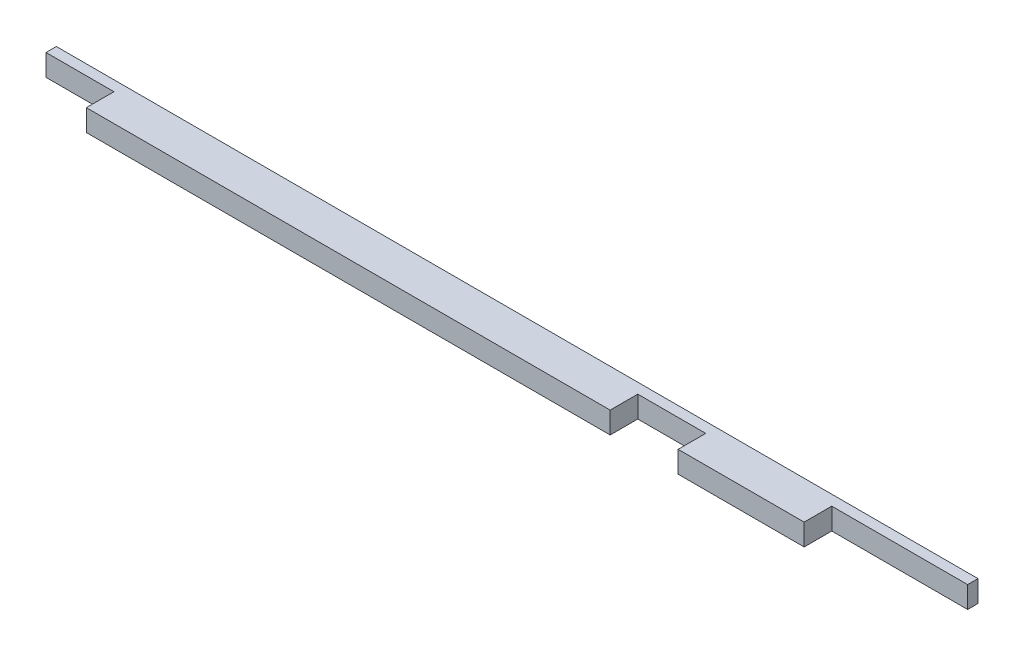
ISO-10303-21;
HEADER;
FILE_DESCRIPTION(('STEP AP214'),'2;1');
FILE_NAME('part.step','',(''),(''),'','','');
FILE_SCHEMA(('AUTOMOTIVE_DESIGN { 1 0 10303 214 1 1 1 1 }'));
ENDSEC;
DATA;
#1=APPLICATION_CONTEXT('core data for automotive mechanical design processes');
#2=APPLICATION_PROTOCOL_DEFINITION('international standard','automotive_design',2000,#1);
#3=PRODUCT_CONTEXT('',#1,'mechanical');
#4=PRODUCT('Part','Part','',(#3));
#5=PRODUCT_RELATED_PRODUCT_CATEGORY('part','',(#4));
#6=PRODUCT_DEFINITION_FORMATION('','',#4);
#7=PRODUCT_DEFINITION_CONTEXT('part definition',#1,'design');
#8=PRODUCT_DEFINITION('design','',#6,#7);
#9=PRODUCT_DEFINITION_SHAPE('','',#8);
#10=(LENGTH_UNIT() NAMED_UNIT(*) SI_UNIT(.MILLI.,.METRE.));
#11=(NAMED_UNIT(*) PLANE_ANGLE_UNIT() SI_UNIT($,.RADIAN.));
#12=(NAMED_UNIT(*) SI_UNIT($,.STERADIAN.) SOLID_ANGLE_UNIT());
#13=UNCERTAINTY_MEASURE_WITH_UNIT(LENGTH_MEASURE(1.E-05),#10,'distance_accuracy_value','');
#14=(GEOMETRIC_REPRESENTATION_CONTEXT(3) GLOBAL_UNCERTAINTY_ASSIGNED_CONTEXT((#13)) GLOBAL_UNIT_ASSIGNED_CONTEXT((#10,
#11,#12)) REPRESENTATION_CONTEXT('',''));
#15=CARTESIAN_POINT('',(0.,0.,0.));
#16=DIRECTION('',(0.,0.,1.));
#17=DIRECTION('',(1.,0.,0.));
#18=AXIS2_PLACEMENT_3D('',#15,#16,#17);
#19=CARTESIAN_POINT('',(0.,1.5875,0.));
#20=DIRECTION('',(0.,0.,-1.));
#21=DIRECTION('',(-1.,0.,0.));
#22=AXIS2_PLACEMENT_3D('',#19,#20,#21);
#23=PLANE('',#22);
#24=DIRECTION('',(1.,0.,0.));
#25=VECTOR('',#24,1.);
#26=CARTESIAN_POINT('',(0.,0.,0.));
#27=LINE('',#26,#25);
#28=CARTESIAN_POINT('',(5.,0.,0.));
#29=VERTEX_POINT('',#28);
#30=CARTESIAN_POINT('',(43.55125958,0.,0.));
#31=VERTEX_POINT('',#30);
#32=EDGE_CURVE('E156',#29,#31,#27,.T.);
#33=ORIENTED_EDGE('',*,*,#32,.T.);
#34=DIRECTION('',(0.,-1.,0.));
#35=VECTOR('',#34,1.);
#36=CARTESIAN_POINT('',(43.55125958,1.5875,0.));
#37=LINE('',#36,#35);
#38=CARTESIAN_POINT('',(43.55125958,1.5875,0.));
#39=VERTEX_POINT('',#38);
#40=EDGE_CURVE('E11',#39,#31,#37,.T.);
#41=ORIENTED_EDGE('',*,*,#40,.F.);
#42=DIRECTION('',(1.,0.,0.));
#43=VECTOR('',#42,1.);
#44=CARTESIAN_POINT('',(0.,1.5875,0.));
#45=LINE('',#44,#43);
#46=CARTESIAN_POINT('',(5.,1.5875,0.));
#47=VERTEX_POINT('',#46);
#48=EDGE_CURVE('E185',#47,#39,#45,.T.);
#49=ORIENTED_EDGE('',*,*,#48,.F.);
#50=DIRECTION('',(0.,-1.,0.));
#51=VECTOR('',#50,1.);
#52=CARTESIAN_POINT('',(5.,1.5875,0.));
#53=LINE('',#52,#51);
#54=EDGE_CURVE('E51',#47,#29,#53,.T.);
#55=ORIENTED_EDGE('',*,*,#54,.T.);
#56=EDGE_LOOP('',(#33,#41,#49,#55));
#57=FACE_BOUND('',#56,.T.);
#58=ADVANCED_FACE('F35',(#57),#23,.F.);
#59=CARTESIAN_POINT('',(43.55125958,1.5875,0.));
#60=DIRECTION('',(-1.,0.,0.));
#61=DIRECTION('',(0.,0.,1.));
#62=AXIS2_PLACEMENT_3D('',#59,#60,#61);
#63=PLANE('',#62);
#64=DIRECTION('',(0.,0.,-1.));
#65=VECTOR('',#64,1.);
#66=CARTESIAN_POINT('',(43.55125958,0.,0.));
#67=LINE('',#66,#65);
#68=CARTESIAN_POINT('',(43.55125958,0.,-2.032));
#69=VERTEX_POINT('',#68);
#70=EDGE_CURVE('E158',#31,#69,#67,.T.);
#71=ORIENTED_EDGE('',*,*,#70,.T.);
#72=DIRECTION('',(0.,-1.,0.));
#73=VECTOR('',#72,1.);
#74=CARTESIAN_POINT('',(43.55125958,1.5875,-2.032));
#75=LINE('',#74,#73);
#76=CARTESIAN_POINT('',(43.55125958,1.5875,-2.032));
#77=VERTEX_POINT('',#76);
#78=EDGE_CURVE('E43',#77,#69,#75,.T.);
#79=ORIENTED_EDGE('',*,*,#78,.F.);
#80=DIRECTION('',(0.,0.,-1.));
#81=VECTOR('',#80,1.);
#82=CARTESIAN_POINT('',(43.55125958,1.5875,0.));
#83=LINE('',#82,#81);
#84=EDGE_CURVE('E102',#39,#77,#83,.T.);
#85=ORIENTED_EDGE('',*,*,#84,.F.);
#86=ORIENTED_EDGE('',*,*,#40,.T.);
#87=EDGE_LOOP('',(#71,#79,#85,#86));
#88=FACE_BOUND('',#87,.T.);
#89=ADVANCED_FACE('F250',(#88),#63,.F.);
#90=CARTESIAN_POINT('',(0.,1.5875,-2.032));
#91=DIRECTION('',(0.,0.,-1.));
#92=DIRECTION('',(-1.,0.,0.));
#93=AXIS2_PLACEMENT_3D('',#90,#91,#92);
#94=PLANE('',#93);
#95=DIRECTION('',(1.,0.,0.));
#96=VECTOR('',#95,1.);
#97=CARTESIAN_POINT('',(0.,0.,-2.032));
#98=LINE('',#97,#96);
#99=CARTESIAN_POINT('',(48.55125958,0.,-2.032));
#100=VERTEX_POINT('',#99);
#101=EDGE_CURVE('E160',#69,#100,#98,.T.);
#102=ORIENTED_EDGE('',*,*,#101,.T.);
#103=DIRECTION('',(0.,-1.,0.));
#104=VECTOR('',#103,1.);
#105=CARTESIAN_POINT('',(48.55125958,1.5875,-2.032));
#106=LINE('',#105,#104);
#107=CARTESIAN_POINT('',(48.55125958,1.5875,-2.032));
#108=VERTEX_POINT('',#107);
#109=EDGE_CURVE('E200',#108,#100,#106,.T.);
#110=ORIENTED_EDGE('',*,*,#109,.F.);
#111=DIRECTION('',(1.,0.,0.));
#112=VECTOR('',#111,1.);
#113=CARTESIAN_POINT('',(0.,1.5875,-2.032));
#114=LINE('',#113,#112);
#115=EDGE_CURVE('E208',#77,#108,#114,.T.);
#116=ORIENTED_EDGE('',*,*,#115,.F.);
#117=ORIENTED_EDGE('',*,*,#78,.T.);
#118=EDGE_LOOP('',(#102,#110,#116,#117));
#119=FACE_BOUND('',#118,.T.);
#120=ADVANCED_FACE('F206',(#119),#94,.F.);
#121=CARTESIAN_POINT('',(48.55125958,1.5875,0.));
#122=DIRECTION('',(1.,0.,0.));
#123=DIRECTION('',(0.,0.,-1.));
#124=AXIS2_PLACEMENT_3D('',#121,#122,#123);
#125=PLANE('',#124);
#126=DIRECTION('',(0.,0.,1.));
#127=VECTOR('',#126,1.);
#128=CARTESIAN_POINT('',(48.55125958,0.,0.));
#129=LINE('',#128,#127);
#130=CARTESIAN_POINT('',(48.55125958,0.,0.));
#131=VERTEX_POINT('',#130);
#132=EDGE_CURVE('E162',#100,#131,#129,.T.);
#133=ORIENTED_EDGE('',*,*,#132,.T.);
#134=DIRECTION('',(0.,-1.,0.));
#135=VECTOR('',#134,1.);
#136=CARTESIAN_POINT('',(48.55125958,1.5875,0.));
#137=LINE('',#136,#135);
#138=CARTESIAN_POINT('',(48.55125958,1.5875,0.));
#139=VERTEX_POINT('',#138);
#140=EDGE_CURVE('E197',#139,#131,#137,.T.);
#141=ORIENTED_EDGE('',*,*,#140,.F.);
#142=DIRECTION('',(0.,0.,1.));
#143=VECTOR('',#142,1.);
#144=CARTESIAN_POINT('',(48.55125958,1.5875,0.));
#145=LINE('',#144,#143);
#146=EDGE_CURVE('E225',#108,#139,#145,.T.);
#147=ORIENTED_EDGE('',*,*,#146,.F.);
#148=ORIENTED_EDGE('',*,*,#109,.T.);
#149=EDGE_LOOP('',(#133,#141,#147,#148));
#150=FACE_BOUND('',#149,.T.);
#151=ADVANCED_FACE('F215',(#150),#125,.F.);
#152=CARTESIAN_POINT('',(0.,1.5875,0.));
#153=DIRECTION('',(0.,0.,-1.));
#154=DIRECTION('',(-1.,0.,0.));
#155=AXIS2_PLACEMENT_3D('',#152,#153,#154);
#156=PLANE('',#155);
#157=DIRECTION('',(1.,0.,0.));
#158=VECTOR('',#157,1.);
#159=CARTESIAN_POINT('',(0.,0.,0.));
#160=LINE('',#159,#158);
#161=CARTESIAN_POINT('',(57.82689,0.,0.));
#162=VERTEX_POINT('',#161);
#163=EDGE_CURVE('E164',#131,#162,#160,.T.);
#164=ORIENTED_EDGE('',*,*,#163,.T.);
#165=DIRECTION('',(0.,-1.,0.));
#166=VECTOR('',#165,1.);
#167=CARTESIAN_POINT('',(57.82689,1.5875,0.));
#168=LINE('',#167,#166);
#169=CARTESIAN_POINT('',(57.82689,1.5875,0.));
#170=VERTEX_POINT('',#169);
#171=EDGE_CURVE('E195',#170,#162,#168,.T.);
#172=ORIENTED_EDGE('',*,*,#171,.F.);
#173=DIRECTION('',(1.,0.,0.));
#174=VECTOR('',#173,1.);
#175=CARTESIAN_POINT('',(0.,1.5875,0.));
#176=LINE('',#175,#174);
#177=EDGE_CURVE('E221',#139,#170,#176,.T.);
#178=ORIENTED_EDGE('',*,*,#177,.F.);
#179=ORIENTED_EDGE('',*,*,#140,.T.);
#180=EDGE_LOOP('',(#164,#172,#178,#179));
#181=FACE_BOUND('',#180,.T.);
#182=ADVANCED_FACE('F219',(#181),#156,.F.);
#183=CARTESIAN_POINT('',(57.82689,1.5875,0.));
#184=DIRECTION('',(1.,0.,0.));
#185=DIRECTION('',(0.,0.,-1.));
#186=AXIS2_PLACEMENT_3D('',#183,#184,#185);
#187=PLANE('',#186);
#188=DIRECTION('',(0.,0.,1.));
#189=VECTOR('',#188,1.);
#190=CARTESIAN_POINT('',(57.82689,0.,0.));
#191=LINE('',#190,#189);
#192=CARTESIAN_POINT('',(57.82689,0.,-2.032));
#193=VERTEX_POINT('',#192);
#194=EDGE_CURVE('E167',#193,#162,#191,.T.);
#195=ORIENTED_EDGE('',*,*,#194,.F.);
#196=DIRECTION('',(0.,-1.,0.));
#197=VECTOR('',#196,1.);
#198=CARTESIAN_POINT('',(57.82689,1.5875,-2.032));
#199=LINE('',#198,#197);
#200=CARTESIAN_POINT('',(57.82689,1.5875,-2.032));
#201=VERTEX_POINT('',#200);
#202=EDGE_CURVE('E193',#201,#193,#199,.T.);
#203=ORIENTED_EDGE('',*,*,#202,.F.);
#204=DIRECTION('',(0.,0.,1.));
#205=VECTOR('',#204,1.);
#206=CARTESIAN_POINT('',(57.82689,1.5875,0.));
#207=LINE('',#206,#205);
#208=EDGE_CURVE('E224',#201,#170,#207,.T.);
#209=ORIENTED_EDGE('',*,*,#208,.T.);
#210=ORIENTED_EDGE('',*,*,#171,.T.);
#211=EDGE_LOOP('',(#195,#203,#209,#210));
#212=FACE_BOUND('',#211,.T.);
#213=ADVANCED_FACE('F266',(#212),#187,.T.);
#214=CARTESIAN_POINT('',(0.,1.5875,-2.032));
#215=DIRECTION('',(0.,0.,-1.));
#216=DIRECTION('',(-1.,0.,0.));
#217=AXIS2_PLACEMENT_3D('',#214,#215,#216);
#218=PLANE('',#217);
#219=DIRECTION('',(1.,0.,0.));
#220=VECTOR('',#219,1.);
#221=CARTESIAN_POINT('',(0.,0.,-2.032));
#222=LINE('',#221,#220);
#223=CARTESIAN_POINT('',(67.82689,0.,-2.032));
#224=VERTEX_POINT('',#223);
#225=EDGE_CURVE('E170',#193,#224,#222,.T.);
#226=ORIENTED_EDGE('',*,*,#225,.T.);
#227=DIRECTION('',(0.,-1.,0.));
#228=VECTOR('',#227,1.);
#229=CARTESIAN_POINT('',(67.82689,1.5875,-2.032));
#230=LINE('',#229,#228);
#231=CARTESIAN_POINT('',(67.82689,1.5875,-2.032));
#232=VERTEX_POINT('',#231);
#233=EDGE_CURVE('E191',#232,#224,#230,.T.);
#234=ORIENTED_EDGE('',*,*,#233,.F.);
#235=DIRECTION('',(1.,0.,0.));
#236=VECTOR('',#235,1.);
#237=CARTESIAN_POINT('',(0.,1.5875,-2.032));
#238=LINE('',#237,#236);
#239=EDGE_CURVE('E227',#201,#232,#238,.T.);
#240=ORIENTED_EDGE('',*,*,#239,.F.);
#241=ORIENTED_EDGE('',*,*,#202,.T.);
#242=EDGE_LOOP('',(#226,#234,#240,#241));
#243=FACE_BOUND('',#242,.T.);
#244=ADVANCED_FACE('F269',(#243),#218,.F.);
#245=CARTESIAN_POINT('',(67.82689,1.5875,0.));
#246=DIRECTION('',(1.,0.,0.));
#247=DIRECTION('',(0.,0.,-1.));
#248=AXIS2_PLACEMENT_3D('',#245,#246,#247);
#249=PLANE('',#248);
#250=DIRECTION('',(0.,0.,1.));
#251=VECTOR('',#250,1.);
#252=CARTESIAN_POINT('',(67.82689,0.,0.));
#253=LINE('',#252,#251);
#254=CARTESIAN_POINT('',(67.82689,0.,-2.794));
#255=VERTEX_POINT('',#254);
#256=EDGE_CURVE('E173',#255,#224,#253,.T.);
#257=ORIENTED_EDGE('',*,*,#256,.F.);
#258=DIRECTION('',(0.,-1.,0.));
#259=VECTOR('',#258,1.);
#260=CARTESIAN_POINT('',(67.82689,1.5875,-2.794));
#261=LINE('',#260,#259);
#262=CARTESIAN_POINT('',(67.82689,1.5875,-2.794));
#263=VERTEX_POINT('',#262);
#264=EDGE_CURVE('E189',#263,#255,#261,.T.);
#265=ORIENTED_EDGE('',*,*,#264,.F.);
#266=DIRECTION('',(0.,0.,1.));
#267=VECTOR('',#266,1.);
#268=CARTESIAN_POINT('',(67.82689,1.5875,0.));
#269=LINE('',#268,#267);
#270=EDGE_CURVE('E233',#263,#232,#269,.T.);
#271=ORIENTED_EDGE('',*,*,#270,.T.);
#272=ORIENTED_EDGE('',*,*,#233,.T.);
#273=EDGE_LOOP('',(#257,#265,#271,#272));
#274=FACE_BOUND('',#273,.T.);
#275=ADVANCED_FACE('F273',(#274),#249,.T.);
#276=CARTESIAN_POINT('',(0.,1.5875,-2.794));
#277=DIRECTION('',(0.,0.,-1.));
#278=DIRECTION('',(-1.,0.,0.));
#279=AXIS2_PLACEMENT_3D('',#276,#277,#278);
#280=PLANE('',#279);
#281=DIRECTION('',(1.,0.,0.));
#282=VECTOR('',#281,1.);
#283=CARTESIAN_POINT('',(0.,0.,-2.794));
#284=LINE('',#283,#282);
#285=CARTESIAN_POINT('',(0.,0.,-2.794));
#286=VERTEX_POINT('',#285);
#287=EDGE_CURVE('E176',#286,#255,#284,.T.);
#288=ORIENTED_EDGE('',*,*,#287,.F.);
#289=DIRECTION('',(0.,-1.,0.));
#290=VECTOR('',#289,1.);
#291=CARTESIAN_POINT('',(0.,1.5875,-2.794));
#292=LINE('',#291,#290);
#293=CARTESIAN_POINT('',(0.,1.5875,-2.794));
#294=VERTEX_POINT('',#293);
#295=EDGE_CURVE('E148',#294,#286,#292,.T.);
#296=ORIENTED_EDGE('',*,*,#295,.F.);
#297=DIRECTION('',(1.,0.,0.));
#298=VECTOR('',#297,1.);
#299=CARTESIAN_POINT('',(0.,1.5875,-2.794));
#300=LINE('',#299,#298);
#301=EDGE_CURVE('E138',#294,#263,#300,.T.);
#302=ORIENTED_EDGE('',*,*,#301,.T.);
#303=ORIENTED_EDGE('',*,*,#264,.T.);
#304=EDGE_LOOP('',(#288,#296,#302,#303));
#305=FACE_BOUND('',#304,.T.);
#306=ADVANCED_FACE('F237',(#305),#280,.T.);
#307=CARTESIAN_POINT('',(0.,1.5875,0.));
#308=DIRECTION('',(1.,0.,0.));
#309=DIRECTION('',(0.,0.,-1.));
#310=AXIS2_PLACEMENT_3D('',#307,#308,#309);
#311=PLANE('',#310);
#312=DIRECTION('',(0.,0.,1.));
#313=VECTOR('',#312,1.);
#314=CARTESIAN_POINT('',(0.,0.,0.));
#315=LINE('',#314,#313);
#316=CARTESIAN_POINT('',(0.,0.,-2.032));
#317=VERTEX_POINT('',#316);
#318=EDGE_CURVE('E145',#286,#317,#315,.T.);
#319=ORIENTED_EDGE('',*,*,#318,.T.);
#320=DIRECTION('',(0.,-1.,0.));
#321=VECTOR('',#320,1.);
#322=CARTESIAN_POINT('',(0.,1.5875,-2.032));
#323=LINE('',#322,#321);
#324=CARTESIAN_POINT('',(0.,1.5875,-2.032));
#325=VERTEX_POINT('',#324);
#326=EDGE_CURVE('E142',#325,#317,#323,.T.);
#327=ORIENTED_EDGE('',*,*,#326,.F.);
#328=DIRECTION('',(0.,0.,1.));
#329=VECTOR('',#328,1.);
#330=CARTESIAN_POINT('',(0.,1.5875,0.));
#331=LINE('',#330,#329);
#332=EDGE_CURVE('E130',#294,#325,#331,.T.);
#333=ORIENTED_EDGE('',*,*,#332,.F.);
#334=ORIENTED_EDGE('',*,*,#295,.T.);
#335=EDGE_LOOP('',(#319,#327,#333,#334));
#336=FACE_BOUND('',#335,.T.);
#337=ADVANCED_FACE('F143',(#336),#311,.F.);
#338=CARTESIAN_POINT('',(0.,1.5875,-2.032));
#339=DIRECTION('',(0.,0.,-1.));
#340=DIRECTION('',(-1.,0.,0.));
#341=AXIS2_PLACEMENT_3D('',#338,#339,#340);
#342=PLANE('',#341);
#343=DIRECTION('',(1.,0.,0.));
#344=VECTOR('',#343,1.);
#345=CARTESIAN_POINT('',(0.,0.,-2.032));
#346=LINE('',#345,#344);
#347=CARTESIAN_POINT('',(5.,0.,-2.032));
#348=VERTEX_POINT('',#347);
#349=EDGE_CURVE('E180',#317,#348,#346,.T.);
#350=ORIENTED_EDGE('',*,*,#349,.T.);
#351=DIRECTION('',(0.,-1.,0.));
#352=VECTOR('',#351,1.);
#353=CARTESIAN_POINT('',(5.,1.5875,-2.032));
#354=LINE('',#353,#352);
#355=CARTESIAN_POINT('',(5.,1.5875,-2.032));
#356=VERTEX_POINT('',#355);
#357=EDGE_CURVE('E90',#356,#348,#354,.T.);
#358=ORIENTED_EDGE('',*,*,#357,.F.);
#359=DIRECTION('',(1.,0.,0.));
#360=VECTOR('',#359,1.);
#361=CARTESIAN_POINT('',(0.,1.5875,-2.032));
#362=LINE('',#361,#360);
#363=EDGE_CURVE('E135',#325,#356,#362,.T.);
#364=ORIENTED_EDGE('',*,*,#363,.F.);
#365=ORIENTED_EDGE('',*,*,#326,.T.);
#366=EDGE_LOOP('',(#350,#358,#364,#365));
#367=FACE_BOUND('',#366,.T.);
#368=ADVANCED_FACE('F150',(#367),#342,.F.);
#369=CARTESIAN_POINT('',(5.,1.5875,0.));
#370=DIRECTION('',(-1.,0.,0.));
#371=DIRECTION('',(0.,0.,1.));
#372=AXIS2_PLACEMENT_3D('',#369,#370,#371);
#373=PLANE('',#372);
#374=DIRECTION('',(0.,0.,-1.));
#375=VECTOR('',#374,1.);
#376=CARTESIAN_POINT('',(5.,0.,0.));
#377=LINE('',#376,#375);
#378=EDGE_CURVE('E182',#29,#348,#377,.T.);
#379=ORIENTED_EDGE('',*,*,#378,.F.);
#380=ORIENTED_EDGE('',*,*,#54,.F.);
#381=DIRECTION('',(0.,0.,-1.));
#382=VECTOR('',#381,1.);
#383=CARTESIAN_POINT('',(5.,1.5875,0.));
#384=LINE('',#383,#382);
#385=EDGE_CURVE('E151',#47,#356,#384,.T.);
#386=ORIENTED_EDGE('',*,*,#385,.T.);
#387=ORIENTED_EDGE('',*,*,#357,.T.);
#388=EDGE_LOOP('',(#379,#380,#386,#387));
#389=FACE_BOUND('',#388,.T.);
#390=ADVANCED_FACE('F239',(#389),#373,.T.);
#391=CARTESIAN_POINT('',(0.,1.5875,0.));
#392=DIRECTION('',(0.,1.,0.));
#393=DIRECTION('',(0.,0.,1.));
#394=AXIS2_PLACEMENT_3D('',#391,#392,#393);
#395=PLANE('',#394);
#396=ORIENTED_EDGE('',*,*,#48,.T.);
#397=ORIENTED_EDGE('',*,*,#84,.T.);
#398=ORIENTED_EDGE('',*,*,#115,.T.);
#399=ORIENTED_EDGE('',*,*,#146,.T.);
#400=ORIENTED_EDGE('',*,*,#177,.T.);
#401=ORIENTED_EDGE('',*,*,#208,.F.);
#402=ORIENTED_EDGE('',*,*,#239,.T.);
#403=ORIENTED_EDGE('',*,*,#270,.F.);
#404=ORIENTED_EDGE('',*,*,#301,.F.);
#405=ORIENTED_EDGE('',*,*,#332,.T.);
#406=ORIENTED_EDGE('',*,*,#363,.T.);
#407=ORIENTED_EDGE('',*,*,#385,.F.);
#408=EDGE_LOOP('',(#396,#397,#398,#399,#400,#401,#402,#403,#404,#405,#406,#407));
#409=FACE_BOUND('',#408,.T.);
#410=ADVANCED_FACE('F132',(#409),#395,.T.);
#411=CARTESIAN_POINT('',(0.,0.,0.));
#412=DIRECTION('',(0.,1.,0.));
#413=DIRECTION('',(0.,0.,1.));
#414=AXIS2_PLACEMENT_3D('',#411,#412,#413);
#415=PLANE('',#414);
#416=ORIENTED_EDGE('',*,*,#32,.F.);
#417=ORIENTED_EDGE('',*,*,#378,.T.);
#418=ORIENTED_EDGE('',*,*,#349,.F.);
#419=ORIENTED_EDGE('',*,*,#318,.F.);
#420=ORIENTED_EDGE('',*,*,#287,.T.);
#421=ORIENTED_EDGE('',*,*,#256,.T.);
#422=ORIENTED_EDGE('',*,*,#225,.F.);
#423=ORIENTED_EDGE('',*,*,#194,.T.);
#424=ORIENTED_EDGE('',*,*,#163,.F.);
#425=ORIENTED_EDGE('',*,*,#132,.F.);
#426=ORIENTED_EDGE('',*,*,#101,.F.);
#427=ORIENTED_EDGE('',*,*,#70,.F.);
#428=EDGE_LOOP('',(#416,#417,#418,#419,#420,#421,#422,#423,#424,#425,#426,#427));
#429=FACE_BOUND('',#428,.T.);
#430=ADVANCED_FACE('F211',(#429),#415,.F.);
#431=CLOSED_SHELL('',(#58,#89,#120,#151,#182,#213,#244,#275,#306,#337,#368,#390,#410,#430));
#432=MANIFOLD_SOLID_BREP('B2',#431);
#433=ADVANCED_BREP_SHAPE_REPRESENTATION('',(#18,#432),#14);
#434=SHAPE_DEFINITION_REPRESENTATION(#9,#433);
ENDSEC;
END-ISO-10303-21;
